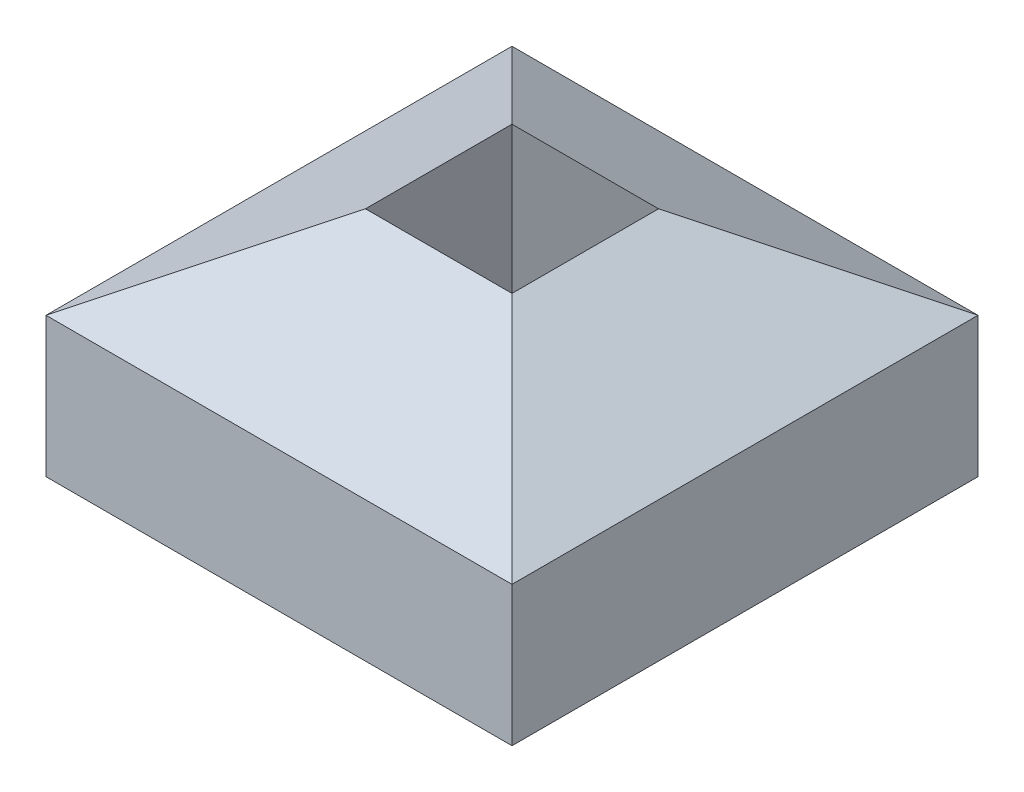
ISO-10303-21;
HEADER;
FILE_DESCRIPTION(('STEP AP214'),'2;1');
FILE_NAME('part.step','',(''),(''),'','','');
FILE_SCHEMA(('AUTOMOTIVE_DESIGN { 1 0 10303 214 1 1 1 1 }'));
ENDSEC;
DATA;
#1=APPLICATION_CONTEXT('core data for automotive mechanical design processes');
#2=APPLICATION_PROTOCOL_DEFINITION('international standard','automotive_design',2000,#1);
#3=PRODUCT_CONTEXT('',#1,'mechanical');
#4=PRODUCT('Part','Part','',(#3));
#5=PRODUCT_RELATED_PRODUCT_CATEGORY('part','',(#4));
#6=PRODUCT_DEFINITION_FORMATION('','',#4);
#7=PRODUCT_DEFINITION_CONTEXT('part definition',#1,'design');
#8=PRODUCT_DEFINITION('design','',#6,#7);
#9=PRODUCT_DEFINITION_SHAPE('','',#8);
#10=(LENGTH_UNIT() NAMED_UNIT(*) SI_UNIT(.MILLI.,.METRE.));
#11=(NAMED_UNIT(*) PLANE_ANGLE_UNIT() SI_UNIT($,.RADIAN.));
#12=(NAMED_UNIT(*) SI_UNIT($,.STERADIAN.) SOLID_ANGLE_UNIT());
#13=UNCERTAINTY_MEASURE_WITH_UNIT(LENGTH_MEASURE(1.E-05),#10,'distance_accuracy_value','');
#14=(GEOMETRIC_REPRESENTATION_CONTEXT(3) GLOBAL_UNCERTAINTY_ASSIGNED_CONTEXT((#13)) GLOBAL_UNIT_ASSIGNED_CONTEXT((#10,
#11,#12)) REPRESENTATION_CONTEXT('',''));
#15=CARTESIAN_POINT('',(0.,0.,0.));
#16=DIRECTION('',(0.,0.,1.));
#17=DIRECTION('',(1.,0.,0.));
#18=AXIS2_PLACEMENT_3D('',#15,#16,#17);
#19=CARTESIAN_POINT('',(-1270.,762.,1270.));
#20=DIRECTION('',(1.,0.,0.));
#21=DIRECTION('',(0.,0.,-1.));
#22=AXIS2_PLACEMENT_3D('',#19,#20,#21);
#23=PLANE('',#22);
#24=DIRECTION('',(0.,0.,1.));
#25=VECTOR('',#24,1.);
#26=CARTESIAN_POINT('',(-1270.,0.,1270.));
#27=LINE('',#26,#25);
#28=CARTESIAN_POINT('',(-1270.,0.,-1270.));
#29=VERTEX_POINT('',#28);
#30=CARTESIAN_POINT('',(-1270.,0.,1270.));
#31=VERTEX_POINT('',#30);
#32=EDGE_CURVE('E152',#29,#31,#27,.T.);
#33=ORIENTED_EDGE('',*,*,#32,.T.);
#34=DIRECTION('',(0.,-1.,0.));
#35=VECTOR('',#34,1.);
#36=CARTESIAN_POINT('',(-1270.,762.,1270.));
#37=LINE('',#36,#35);
#38=CARTESIAN_POINT('',(-1270.,762.,1270.));
#39=VERTEX_POINT('',#38);
#40=EDGE_CURVE('E47',#39,#31,#37,.T.);
#41=ORIENTED_EDGE('',*,*,#40,.F.);
#42=DIRECTION('',(0.,0.,1.));
#43=VECTOR('',#42,1.);
#44=CARTESIAN_POINT('',(-1270.,762.,1270.));
#45=LINE('',#44,#43);
#46=CARTESIAN_POINT('',(-1270.,762.,-1270.));
#47=VERTEX_POINT('',#46);
#48=EDGE_CURVE('E161',#47,#39,#45,.T.);
#49=ORIENTED_EDGE('',*,*,#48,.F.);
#50=DIRECTION('',(0.,-1.,0.));
#51=VECTOR('',#50,1.);
#52=CARTESIAN_POINT('',(-1270.,762.,-1270.));
#53=LINE('',#52,#51);
#54=EDGE_CURVE('E178',#47,#29,#53,.T.);
#55=ORIENTED_EDGE('',*,*,#54,.T.);
#56=EDGE_LOOP('',(#33,#41,#49,#55));
#57=FACE_BOUND('',#56,.T.);
#58=ADVANCED_FACE('F39',(#57),#23,.F.);
#59=CARTESIAN_POINT('',(1270.,762.,1270.));
#60=DIRECTION('',(0.,0.,-1.));
#61=DIRECTION('',(-1.,0.,0.));
#62=AXIS2_PLACEMENT_3D('',#59,#60,#61);
#63=PLANE('',#62);
#64=DIRECTION('',(1.,0.,0.));
#65=VECTOR('',#64,1.);
#66=CARTESIAN_POINT('',(1270.,0.,1270.));
#67=LINE('',#66,#65);
#68=CARTESIAN_POINT('',(1270.,0.,1270.));
#69=VERTEX_POINT('',#68);
#70=EDGE_CURVE('E182',#31,#69,#67,.T.);
#71=ORIENTED_EDGE('',*,*,#70,.T.);
#72=DIRECTION('',(0.,-1.,0.));
#73=VECTOR('',#72,1.);
#74=CARTESIAN_POINT('',(1270.,762.,1270.));
#75=LINE('',#74,#73);
#76=CARTESIAN_POINT('',(1270.,762.,1270.));
#77=VERTEX_POINT('',#76);
#78=EDGE_CURVE('E197',#77,#69,#75,.T.);
#79=ORIENTED_EDGE('',*,*,#78,.F.);
#80=DIRECTION('',(1.,0.,0.));
#81=VECTOR('',#80,1.);
#82=CARTESIAN_POINT('',(1270.,762.,1270.));
#83=LINE('',#82,#81);
#84=EDGE_CURVE('E165',#39,#77,#83,.T.);
#85=ORIENTED_EDGE('',*,*,#84,.F.);
#86=ORIENTED_EDGE('',*,*,#40,.T.);
#87=EDGE_LOOP('',(#71,#79,#85,#86));
#88=FACE_BOUND('',#87,.T.);
#89=ADVANCED_FACE('F205',(#88),#63,.F.);
#90=CARTESIAN_POINT('',(1270.,762.,1270.));
#91=DIRECTION('',(-1.,0.,0.));
#92=DIRECTION('',(0.,0.,1.));
#93=AXIS2_PLACEMENT_3D('',#90,#91,#92);
#94=PLANE('',#93);
#95=DIRECTION('',(0.,0.,-1.));
#96=VECTOR('',#95,1.);
#97=CARTESIAN_POINT('',(1270.,0.,1270.));
#98=LINE('',#97,#96);
#99=CARTESIAN_POINT('',(1270.,0.,-1270.));
#100=VERTEX_POINT('',#99);
#101=EDGE_CURVE('E185',#69,#100,#98,.T.);
#102=ORIENTED_EDGE('',*,*,#101,.T.);
#103=DIRECTION('',(0.,-1.,0.));
#104=VECTOR('',#103,1.);
#105=CARTESIAN_POINT('',(1270.,762.,-1270.));
#106=LINE('',#105,#104);
#107=CARTESIAN_POINT('',(1270.,762.,-1270.));
#108=VERTEX_POINT('',#107);
#109=EDGE_CURVE('E193',#108,#100,#106,.T.);
#110=ORIENTED_EDGE('',*,*,#109,.F.);
#111=DIRECTION('',(0.,0.,-1.));
#112=VECTOR('',#111,1.);
#113=CARTESIAN_POINT('',(1270.,762.,1270.));
#114=LINE('',#113,#112);
#115=EDGE_CURVE('E170',#77,#108,#114,.T.);
#116=ORIENTED_EDGE('',*,*,#115,.F.);
#117=ORIENTED_EDGE('',*,*,#78,.T.);
#118=EDGE_LOOP('',(#102,#110,#116,#117));
#119=FACE_BOUND('',#118,.T.);
#120=ADVANCED_FACE('F215',(#119),#94,.F.);
#121=CARTESIAN_POINT('',(1270.,762.,-1270.));
#122=DIRECTION('',(0.,0.,1.));
#123=DIRECTION('',(1.,0.,0.));
#124=AXIS2_PLACEMENT_3D('',#121,#122,#123);
#125=PLANE('',#124);
#126=DIRECTION('',(-1.,0.,0.));
#127=VECTOR('',#126,1.);
#128=CARTESIAN_POINT('',(1270.,0.,-1270.));
#129=LINE('',#128,#127);
#130=EDGE_CURVE('E166',#100,#29,#129,.T.);
#131=ORIENTED_EDGE('',*,*,#130,.T.);
#132=ORIENTED_EDGE('',*,*,#54,.F.);
#133=DIRECTION('',(-1.,0.,0.));
#134=VECTOR('',#133,1.);
#135=CARTESIAN_POINT('',(1270.,762.,-1270.));
#136=LINE('',#135,#134);
#137=EDGE_CURVE('E174',#108,#47,#136,.T.);
#138=ORIENTED_EDGE('',*,*,#137,.F.);
#139=ORIENTED_EDGE('',*,*,#109,.T.);
#140=EDGE_LOOP('',(#131,#132,#138,#139));
#141=FACE_BOUND('',#140,.T.);
#142=ADVANCED_FACE('F219',(#141),#125,.F.);
#143=CARTESIAN_POINT('',(0.,0.,0.));
#144=DIRECTION('',(0.,1.,0.));
#145=DIRECTION('',(0.,0.,1.));
#146=AXIS2_PLACEMENT_3D('',#143,#144,#145);
#147=PLANE('',#146);
#148=DIRECTION('',(1.,0.,0.));
#149=VECTOR('',#148,1.);
#150=CARTESIAN_POINT('',(762.,0.,-762.));
#151=LINE('',#150,#149);
#152=CARTESIAN_POINT('',(-762.,0.,-762.));
#153=VERTEX_POINT('',#152);
#154=CARTESIAN_POINT('',(762.,0.,-762.));
#155=VERTEX_POINT('',#154);
#156=EDGE_CURVE('E116',#153,#155,#151,.T.);
#157=ORIENTED_EDGE('',*,*,#156,.F.);
#158=DIRECTION('',(0.,0.,-1.));
#159=VECTOR('',#158,1.);
#160=CARTESIAN_POINT('',(-762.,0.,-762.));
#161=LINE('',#160,#159);
#162=CARTESIAN_POINT('',(-762.,0.,762.));
#163=VERTEX_POINT('',#162);
#164=EDGE_CURVE('E54',#163,#153,#161,.T.);
#165=ORIENTED_EDGE('',*,*,#164,.F.);
#166=DIRECTION('',(-1.,0.,0.));
#167=VECTOR('',#166,1.);
#168=CARTESIAN_POINT('',(762.,0.,762.));
#169=LINE('',#168,#167);
#170=CARTESIAN_POINT('',(762.,0.,762.));
#171=VERTEX_POINT('',#170);
#172=EDGE_CURVE('E124',#171,#163,#169,.T.);
#173=ORIENTED_EDGE('',*,*,#172,.F.);
#174=DIRECTION('',(0.,0.,1.));
#175=VECTOR('',#174,1.);
#176=CARTESIAN_POINT('',(762.,0.,-762.));
#177=LINE('',#176,#175);
#178=EDGE_CURVE('E107',#155,#171,#177,.T.);
#179=ORIENTED_EDGE('',*,*,#178,.F.);
#180=EDGE_LOOP('',(#157,#165,#173,#179));
#181=FACE_BOUND('',#180,.T.);
#182=ORIENTED_EDGE('',*,*,#32,.F.);
#183=ORIENTED_EDGE('',*,*,#130,.F.);
#184=ORIENTED_EDGE('',*,*,#101,.F.);
#185=ORIENTED_EDGE('',*,*,#70,.F.);
#186=EDGE_LOOP('',(#182,#183,#184,#185));
#187=FACE_BOUND('',#186,.T.);
#188=ADVANCED_FACE('F121',(#181,#187),#147,.F.);
#189=CARTESIAN_POINT('',(-1270.,762.,-1270.));
#190=DIRECTION('',(-0.499999999999999,0.866025403784439,0.));
#191=DIRECTION('',(-0.866025403784439,-0.499999999999999,0.));
#192=AXIS2_PLACEMENT_3D('',#189,#190,#191);
#193=PLANE('',#192);
#194=DIRECTION('',(-0.654653670707977,-0.377964473009226,0.654653670707977));
#195=VECTOR('',#194,1.);
#196=CARTESIAN_POINT('',(-1270.,762.,1270.));
#197=LINE('',#196,#195);
#198=CARTESIAN_POINT('',(-399.364032745159,1264.66191006075,399.364032745159));
#199=VERTEX_POINT('',#198);
#200=EDGE_CURVE('E149',#199,#39,#197,.T.);
#201=ORIENTED_EDGE('',*,*,#200,.F.);
#202=DIRECTION('',(0.,0.,1.));
#203=VECTOR('',#202,1.);
#204=CARTESIAN_POINT('',(-399.364032745159,1264.66191006075,-1270.));
#205=LINE('',#204,#203);
#206=CARTESIAN_POINT('',(-399.364032745159,1264.66191006075,-399.364032745159));
#207=VERTEX_POINT('',#206);
#208=EDGE_CURVE('E140',#199,#207,#205,.F.);
#209=ORIENTED_EDGE('',*,*,#208,.T.);
#210=DIRECTION('',(-0.654653670707977,-0.377964473009226,-0.654653670707977));
#211=VECTOR('',#210,1.);
#212=CARTESIAN_POINT('',(-1270.,762.,-1270.));
#213=LINE('',#212,#211);
#214=EDGE_CURVE('E148',#207,#47,#213,.T.);
#215=ORIENTED_EDGE('',*,*,#214,.T.);
#216=ORIENTED_EDGE('',*,*,#48,.T.);
#217=EDGE_LOOP('',(#201,#209,#215,#216));
#218=FACE_BOUND('',#217,.T.);
#219=ADVANCED_FACE('F230',(#218),#193,.T.);
#220=CARTESIAN_POINT('',(-1270.,762.,1270.));
#221=DIRECTION('',(0.,0.866025403784439,0.499999999999999));
#222=DIRECTION('',(0.,-0.499999999999999,0.866025403784439));
#223=AXIS2_PLACEMENT_3D('',#220,#221,#222);
#224=PLANE('',#223);
#225=DIRECTION('',(0.654653670707977,-0.377964473009226,0.654653670707977));
#226=VECTOR('',#225,1.);
#227=CARTESIAN_POINT('',(181.428571428571,1390.48700731785,181.428571428571));
#228=LINE('',#227,#226);
#229=CARTESIAN_POINT('',(399.364032745159,1264.66191006075,399.364032745159));
#230=VERTEX_POINT('',#229);
#231=EDGE_CURVE('E153',#230,#77,#228,.T.);
#232=ORIENTED_EDGE('',*,*,#231,.F.);
#233=DIRECTION('',(1.,0.,0.));
#234=VECTOR('',#233,1.);
#235=CARTESIAN_POINT('',(-1270.,1264.66191006075,399.364032745159));
#236=LINE('',#235,#234);
#237=EDGE_CURVE('E144',#230,#199,#236,.F.);
#238=ORIENTED_EDGE('',*,*,#237,.T.);
#239=ORIENTED_EDGE('',*,*,#200,.T.);
#240=ORIENTED_EDGE('',*,*,#84,.T.);
#241=EDGE_LOOP('',(#232,#238,#239,#240));
#242=FACE_BOUND('',#241,.T.);
#243=ADVANCED_FACE('F227',(#242),#224,.T.);
#244=CARTESIAN_POINT('',(1270.,762.,-1270.));
#245=DIRECTION('',(0.499999999999999,0.866025403784439,0.));
#246=DIRECTION('',(-0.866025403784439,0.499999999999999,0.));
#247=AXIS2_PLACEMENT_3D('',#244,#245,#246);
#248=PLANE('',#247);
#249=DIRECTION('',(0.654653670707977,-0.377964473009226,-0.654653670707977));
#250=VECTOR('',#249,1.);
#251=CARTESIAN_POINT('',(181.428571428571,1390.48700731785,-181.42857142857));
#252=LINE('',#251,#250);
#253=CARTESIAN_POINT('',(399.364032745159,1264.66191006075,-399.364032745159));
#254=VERTEX_POINT('',#253);
#255=EDGE_CURVE('E156',#254,#108,#252,.T.);
#256=ORIENTED_EDGE('',*,*,#255,.F.);
#257=DIRECTION('',(0.,0.,-1.));
#258=VECTOR('',#257,1.);
#259=CARTESIAN_POINT('',(399.364032745159,1264.66191006075,-1270.));
#260=LINE('',#259,#258);
#261=EDGE_CURVE('E110',#254,#230,#260,.F.);
#262=ORIENTED_EDGE('',*,*,#261,.T.);
#263=ORIENTED_EDGE('',*,*,#231,.T.);
#264=ORIENTED_EDGE('',*,*,#115,.T.);
#265=EDGE_LOOP('',(#256,#262,#263,#264));
#266=FACE_BOUND('',#265,.T.);
#267=ADVANCED_FACE('F224',(#266),#248,.T.);
#268=CARTESIAN_POINT('',(-1270.,762.,-1270.));
#269=DIRECTION('',(0.,0.866025403784439,-0.499999999999999));
#270=DIRECTION('',(0.,0.499999999999999,0.866025403784439));
#271=AXIS2_PLACEMENT_3D('',#268,#269,#270);
#272=PLANE('',#271);
#273=ORIENTED_EDGE('',*,*,#214,.F.);
#274=DIRECTION('',(-1.,0.,0.));
#275=VECTOR('',#274,1.);
#276=CARTESIAN_POINT('',(-1270.,1264.66191006075,-399.364032745159));
#277=LINE('',#276,#275);
#278=EDGE_CURVE('E11',#207,#254,#277,.F.);
#279=ORIENTED_EDGE('',*,*,#278,.T.);
#280=ORIENTED_EDGE('',*,*,#255,.T.);
#281=ORIENTED_EDGE('',*,*,#137,.T.);
#282=EDGE_LOOP('',(#273,#279,#280,#281));
#283=FACE_BOUND('',#282,.T.);
#284=ADVANCED_FACE('F231',(#283),#272,.T.);
#285=CARTESIAN_POINT('',(762.,0.,762.));
#286=DIRECTION('',(0.,0.275637355816999,0.961261695938319));
#287=DIRECTION('',(0.,-0.961261695938319,0.275637355816999));
#288=AXIS2_PLACEMENT_3D('',#285,#286,#287);
#289=PLANE('',#288);
#290=DIRECTION('',(0.265727678029987,-0.926702542490083,0.265727678029987));
#291=VECTOR('',#290,1.);
#292=CARTESIAN_POINT('',(654.388532920279,375.285784616731,654.388532920279));
#293=LINE('',#292,#291);
#294=EDGE_CURVE('E112',#230,#171,#293,.T.);
#295=ORIENTED_EDGE('',*,*,#294,.T.);
#296=ORIENTED_EDGE('',*,*,#172,.T.);
#297=DIRECTION('',(-0.265727678029987,-0.926702542490083,0.265727678029987));
#298=VECTOR('',#297,1.);
#299=CARTESIAN_POINT('',(-654.388532920278,375.285784616731,654.388532920278));
#300=LINE('',#299,#298);
#301=EDGE_CURVE('E131',#199,#163,#300,.T.);
#302=ORIENTED_EDGE('',*,*,#301,.F.);
#303=ORIENTED_EDGE('',*,*,#237,.F.);
#304=EDGE_LOOP('',(#295,#296,#302,#303));
#305=FACE_BOUND('',#304,.T.);
#306=ADVANCED_FACE('F235',(#305),#289,.F.);
#307=CARTESIAN_POINT('',(-762.,0.,-762.));
#308=DIRECTION('',(-0.961261695938319,0.275637355816999,0.));
#309=DIRECTION('',(-0.275637355816999,-0.961261695938319,0.));
#310=AXIS2_PLACEMENT_3D('',#307,#308,#309);
#311=PLANE('',#310);
#312=ORIENTED_EDGE('',*,*,#301,.T.);
#313=ORIENTED_EDGE('',*,*,#164,.T.);
#314=DIRECTION('',(-0.265727678029987,-0.926702542490083,-0.265727678029987));
#315=VECTOR('',#314,1.);
#316=CARTESIAN_POINT('',(-762.,0.,-762.));
#317=LINE('',#316,#315);
#318=EDGE_CURVE('E113',#207,#153,#317,.T.);
#319=ORIENTED_EDGE('',*,*,#318,.F.);
#320=ORIENTED_EDGE('',*,*,#208,.F.);
#321=EDGE_LOOP('',(#312,#313,#319,#320));
#322=FACE_BOUND('',#321,.T.);
#323=ADVANCED_FACE('F232',(#322),#311,.F.);
#324=CARTESIAN_POINT('',(762.,0.,-762.));
#325=DIRECTION('',(0.961261695938319,0.275637355816999,0.));
#326=DIRECTION('',(-0.275637355816999,0.961261695938319,0.));
#327=AXIS2_PLACEMENT_3D('',#324,#325,#326);
#328=PLANE('',#327);
#329=DIRECTION('',(0.265727678029987,-0.926702542490083,-0.265727678029987));
#330=VECTOR('',#329,1.);
#331=CARTESIAN_POINT('',(762.,0.,-762.));
#332=LINE('',#331,#330);
#333=EDGE_CURVE('E62',#254,#155,#332,.T.);
#334=ORIENTED_EDGE('',*,*,#333,.T.);
#335=ORIENTED_EDGE('',*,*,#178,.T.);
#336=ORIENTED_EDGE('',*,*,#294,.F.);
#337=ORIENTED_EDGE('',*,*,#261,.F.);
#338=EDGE_LOOP('',(#334,#335,#336,#337));
#339=FACE_BOUND('',#338,.T.);
#340=ADVANCED_FACE('F104',(#339),#328,.F.);
#341=CARTESIAN_POINT('',(762.,0.,-762.));
#342=DIRECTION('',(0.,0.275637355816999,-0.961261695938319));
#343=DIRECTION('',(0.,0.961261695938319,0.275637355816999));
#344=AXIS2_PLACEMENT_3D('',#341,#342,#343);
#345=PLANE('',#344);
#346=ORIENTED_EDGE('',*,*,#318,.T.);
#347=ORIENTED_EDGE('',*,*,#156,.T.);
#348=ORIENTED_EDGE('',*,*,#333,.F.);
#349=ORIENTED_EDGE('',*,*,#278,.F.);
#350=EDGE_LOOP('',(#346,#347,#348,#349));
#351=FACE_BOUND('',#350,.T.);
#352=ADVANCED_FACE('F117',(#351),#345,.F.);
#353=CLOSED_SHELL('',(#58,#89,#120,#142,#188,#219,#243,#267,#284,#306,#323,#340,#352));
#354=MANIFOLD_SOLID_BREP('B2',#353);
#355=ADVANCED_BREP_SHAPE_REPRESENTATION('',(#18,#354),#14);
#356=SHAPE_DEFINITION_REPRESENTATION(#9,#355);
ENDSEC;
END-ISO-10303-21;
